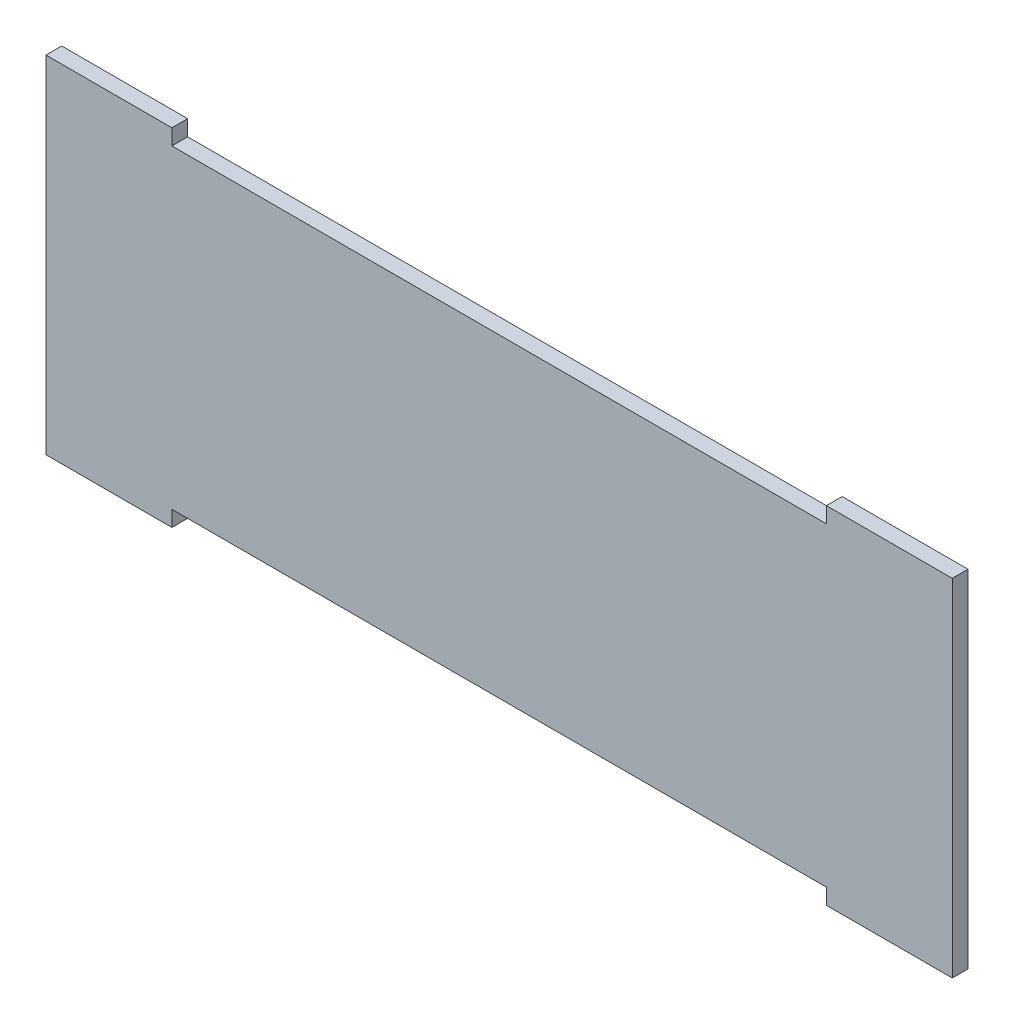
ISO-10303-21;
HEADER;
FILE_DESCRIPTION(('STEP AP214'),'2;1');
FILE_NAME('part.step','',(''),(''),'','','');
FILE_SCHEMA(('AUTOMOTIVE_DESIGN { 1 0 10303 214 1 1 1 1 }'));
ENDSEC;
DATA;
#1=APPLICATION_CONTEXT('core data for automotive mechanical design processes');
#2=APPLICATION_PROTOCOL_DEFINITION('international standard','automotive_design',2000,#1);
#3=PRODUCT_CONTEXT('',#1,'mechanical');
#4=PRODUCT('Part','Part','',(#3));
#5=PRODUCT_RELATED_PRODUCT_CATEGORY('part','',(#4));
#6=PRODUCT_DEFINITION_FORMATION('','',#4);
#7=PRODUCT_DEFINITION_CONTEXT('part definition',#1,'design');
#8=PRODUCT_DEFINITION('design','',#6,#7);
#9=PRODUCT_DEFINITION_SHAPE('','',#8);
#10=(LENGTH_UNIT() NAMED_UNIT(*) SI_UNIT(.MILLI.,.METRE.));
#11=(NAMED_UNIT(*) PLANE_ANGLE_UNIT() SI_UNIT($,.RADIAN.));
#12=(NAMED_UNIT(*) SI_UNIT($,.STERADIAN.) SOLID_ANGLE_UNIT());
#13=UNCERTAINTY_MEASURE_WITH_UNIT(LENGTH_MEASURE(1.E-05),#10,'distance_accuracy_value','');
#14=(GEOMETRIC_REPRESENTATION_CONTEXT(3) GLOBAL_UNCERTAINTY_ASSIGNED_CONTEXT((#13)) GLOBAL_UNIT_ASSIGNED_CONTEXT((#10,
#11,#12)) REPRESENTATION_CONTEXT('',''));
#15=CARTESIAN_POINT('',(0.,0.,0.));
#16=DIRECTION('',(0.,0.,1.));
#17=DIRECTION('',(1.,0.,0.));
#18=AXIS2_PLACEMENT_3D('',#15,#16,#17);
#19=CARTESIAN_POINT('',(-75.4550720880552,48.8403860002817,3.175));
#20=DIRECTION('',(1.,0.,0.));
#21=DIRECTION('',(0.,0.,-1.));
#22=AXIS2_PLACEMENT_3D('',#19,#20,#21);
#23=PLANE('',#22);
#24=DIRECTION('',(0.,-1.,0.));
#25=VECTOR('',#24,1.);
#26=CARTESIAN_POINT('',(-75.4550720880552,48.8403860002817,0.));
#27=LINE('',#26,#25);
#28=CARTESIAN_POINT('',(-75.4550720880552,48.8403860002817,0.));
#29=VERTEX_POINT('',#28);
#30=CARTESIAN_POINT('',(-75.4550720880552,-21.0096139997183,0.));
#31=VERTEX_POINT('',#30);
#32=EDGE_CURVE('E153',#29,#31,#27,.T.);
#33=ORIENTED_EDGE('',*,*,#32,.T.);
#34=DIRECTION('',(0.,0.,-1.));
#35=VECTOR('',#34,1.);
#36=CARTESIAN_POINT('',(-75.4550720880552,-21.0096139997183,3.175));
#37=LINE('',#36,#35);
#38=CARTESIAN_POINT('',(-75.4550720880552,-21.0096139997183,3.175));
#39=VERTEX_POINT('',#38);
#40=EDGE_CURVE('E11',#39,#31,#37,.T.);
#41=ORIENTED_EDGE('',*,*,#40,.F.);
#42=DIRECTION('',(0.,-1.,0.));
#43=VECTOR('',#42,1.);
#44=CARTESIAN_POINT('',(-75.4550720880552,48.8403860002817,3.175));
#45=LINE('',#44,#43);
#46=CARTESIAN_POINT('',(-75.4550720880552,48.8403860002817,3.175));
#47=VERTEX_POINT('',#46);
#48=EDGE_CURVE('E175',#47,#39,#45,.T.);
#49=ORIENTED_EDGE('',*,*,#48,.F.);
#50=DIRECTION('',(0.,0.,-1.));
#51=VECTOR('',#50,1.);
#52=CARTESIAN_POINT('',(-75.4550720880552,48.8403860002817,3.175));
#53=LINE('',#52,#51);
#54=EDGE_CURVE('E149',#47,#29,#53,.T.);
#55=ORIENTED_EDGE('',*,*,#54,.T.);
#56=EDGE_LOOP('',(#33,#41,#49,#55));
#57=FACE_BOUND('',#56,.T.);
#58=ADVANCED_FACE('F33',(#57),#23,.F.);
#59=CARTESIAN_POINT('',(-75.4550720880552,-21.0096139997183,3.175));
#60=DIRECTION('',(0.,1.,0.));
#61=DIRECTION('',(0.,0.,1.));
#62=AXIS2_PLACEMENT_3D('',#59,#60,#61);
#63=PLANE('',#62);
#64=DIRECTION('',(1.,0.,0.));
#65=VECTOR('',#64,1.);
#66=CARTESIAN_POINT('',(-75.4550720880552,-21.0096139997183,0.));
#67=LINE('',#66,#65);
#68=CARTESIAN_POINT('',(-50.0550720880552,-21.0096139997183,0.));
#69=VERTEX_POINT('',#68);
#70=EDGE_CURVE('E156',#31,#69,#67,.T.);
#71=ORIENTED_EDGE('',*,*,#70,.T.);
#72=DIRECTION('',(0.,0.,-1.));
#73=VECTOR('',#72,1.);
#74=CARTESIAN_POINT('',(-50.0550720880552,-21.0096139997183,3.175));
#75=LINE('',#74,#73);
#76=CARTESIAN_POINT('',(-50.0550720880552,-21.0096139997183,3.175));
#77=VERTEX_POINT('',#76);
#78=EDGE_CURVE('E41',#77,#69,#75,.T.);
#79=ORIENTED_EDGE('',*,*,#78,.F.);
#80=DIRECTION('',(1.,0.,0.));
#81=VECTOR('',#80,1.);
#82=CARTESIAN_POINT('',(-75.4550720880552,-21.0096139997183,3.175));
#83=LINE('',#82,#81);
#84=EDGE_CURVE('E104',#39,#77,#83,.T.);
#85=ORIENTED_EDGE('',*,*,#84,.F.);
#86=ORIENTED_EDGE('',*,*,#40,.T.);
#87=EDGE_LOOP('',(#71,#79,#85,#86));
#88=FACE_BOUND('',#87,.T.);
#89=ADVANCED_FACE('F253',(#88),#63,.F.);
#90=CARTESIAN_POINT('',(-50.0550720880552,-21.0096139997183,3.175));
#91=DIRECTION('',(-1.,0.,0.));
#92=DIRECTION('',(0.,-1.,0.));
#93=AXIS2_PLACEMENT_3D('',#90,#91,#92);
#94=PLANE('',#93);
#95=DIRECTION('',(0.,1.,0.));
#96=VECTOR('',#95,1.);
#97=CARTESIAN_POINT('',(-50.0550720880552,-21.0096139997183,0.));
#98=LINE('',#97,#96);
#99=CARTESIAN_POINT('',(-50.0550720880552,-17.8346139997183,0.));
#100=VERTEX_POINT('',#99);
#101=EDGE_CURVE('E158',#69,#100,#98,.T.);
#102=ORIENTED_EDGE('',*,*,#101,.T.);
#103=DIRECTION('',(0.,0.,-1.));
#104=VECTOR('',#103,1.);
#105=CARTESIAN_POINT('',(-50.0550720880552,-17.8346139997183,3.175));
#106=LINE('',#105,#104);
#107=CARTESIAN_POINT('',(-50.0550720880552,-17.8346139997183,3.175));
#108=VERTEX_POINT('',#107);
#109=EDGE_CURVE('E194',#108,#100,#106,.T.);
#110=ORIENTED_EDGE('',*,*,#109,.F.);
#111=DIRECTION('',(0.,1.,0.));
#112=VECTOR('',#111,1.);
#113=CARTESIAN_POINT('',(-50.0550720880552,-21.0096139997183,3.175));
#114=LINE('',#113,#112);
#115=EDGE_CURVE('E202',#77,#108,#114,.T.);
#116=ORIENTED_EDGE('',*,*,#115,.F.);
#117=ORIENTED_EDGE('',*,*,#78,.T.);
#118=EDGE_LOOP('',(#102,#110,#116,#117));
#119=FACE_BOUND('',#118,.T.);
#120=ADVANCED_FACE('F200',(#119),#94,.F.);
#121=CARTESIAN_POINT('',(-50.0550720880552,-17.8346139997183,3.175));
#122=DIRECTION('',(0.,1.,0.));
#123=DIRECTION('',(0.,0.,1.));
#124=AXIS2_PLACEMENT_3D('',#121,#122,#123);
#125=PLANE('',#124);
#126=DIRECTION('',(1.,0.,0.));
#127=VECTOR('',#126,1.);
#128=CARTESIAN_POINT('',(-50.0550720880552,-17.8346139997183,0.));
#129=LINE('',#128,#127);
#130=CARTESIAN_POINT('',(82.0249279119449,-17.8346139997183,0.));
#131=VERTEX_POINT('',#130);
#132=EDGE_CURVE('E160',#100,#131,#129,.T.);
#133=ORIENTED_EDGE('',*,*,#132,.T.);
#134=DIRECTION('',(0.,0.,-1.));
#135=VECTOR('',#134,1.);
#136=CARTESIAN_POINT('',(82.0249279119449,-17.8346139997183,3.175));
#137=LINE('',#136,#135);
#138=CARTESIAN_POINT('',(82.0249279119449,-17.8346139997183,3.175));
#139=VERTEX_POINT('',#138);
#140=EDGE_CURVE('E191',#139,#131,#137,.T.);
#141=ORIENTED_EDGE('',*,*,#140,.F.);
#142=DIRECTION('',(1.,0.,0.));
#143=VECTOR('',#142,1.);
#144=CARTESIAN_POINT('',(-50.0550720880552,-17.8346139997183,3.175));
#145=LINE('',#144,#143);
#146=EDGE_CURVE('E220',#108,#139,#145,.T.);
#147=ORIENTED_EDGE('',*,*,#146,.F.);
#148=ORIENTED_EDGE('',*,*,#109,.T.);
#149=EDGE_LOOP('',(#133,#141,#147,#148));
#150=FACE_BOUND('',#149,.T.);
#151=ADVANCED_FACE('F211',(#150),#125,.F.);
#152=CARTESIAN_POINT('',(82.0249279119448,-21.0096139997183,3.175));
#153=DIRECTION('',(1.,0.,0.));
#154=DIRECTION('',(0.,1.,0.));
#155=AXIS2_PLACEMENT_3D('',#152,#153,#154);
#156=PLANE('',#155);
#157=DIRECTION('',(0.,-1.,0.));
#158=VECTOR('',#157,1.);
#159=CARTESIAN_POINT('',(82.0249279119448,-21.0096139997183,0.));
#160=LINE('',#159,#158);
#161=CARTESIAN_POINT('',(82.0249279119448,-21.0096139997183,0.));
#162=VERTEX_POINT('',#161);
#163=EDGE_CURVE('E162',#131,#162,#160,.T.);
#164=ORIENTED_EDGE('',*,*,#163,.T.);
#165=DIRECTION('',(0.,0.,-1.));
#166=VECTOR('',#165,1.);
#167=CARTESIAN_POINT('',(82.0249279119448,-21.0096139997183,3.175));
#168=LINE('',#167,#166);
#169=CARTESIAN_POINT('',(82.0249279119448,-21.0096139997183,3.175));
#170=VERTEX_POINT('',#169);
#171=EDGE_CURVE('E188',#170,#162,#168,.T.);
#172=ORIENTED_EDGE('',*,*,#171,.F.);
#173=DIRECTION('',(0.,-1.,0.));
#174=VECTOR('',#173,1.);
#175=CARTESIAN_POINT('',(82.0249279119448,-21.0096139997183,3.175));
#176=LINE('',#175,#174);
#177=EDGE_CURVE('E217',#139,#170,#176,.T.);
#178=ORIENTED_EDGE('',*,*,#177,.F.);
#179=ORIENTED_EDGE('',*,*,#140,.T.);
#180=EDGE_LOOP('',(#164,#172,#178,#179));
#181=FACE_BOUND('',#180,.T.);
#182=ADVANCED_FACE('F215',(#181),#156,.F.);
#183=CARTESIAN_POINT('',(82.0249279119448,-21.0096139997183,3.175));
#184=DIRECTION('',(0.,1.,0.));
#185=DIRECTION('',(0.,0.,1.));
#186=AXIS2_PLACEMENT_3D('',#183,#184,#185);
#187=PLANE('',#186);
#188=DIRECTION('',(1.,0.,0.));
#189=VECTOR('',#188,1.);
#190=CARTESIAN_POINT('',(82.0249279119448,-21.0096139997183,0.));
#191=LINE('',#190,#189);
#192=CARTESIAN_POINT('',(107.424927911945,-21.0096139997183,0.));
#193=VERTEX_POINT('',#192);
#194=EDGE_CURVE('E164',#162,#193,#191,.T.);
#195=ORIENTED_EDGE('',*,*,#194,.T.);
#196=DIRECTION('',(0.,0.,-1.));
#197=VECTOR('',#196,1.);
#198=CARTESIAN_POINT('',(107.424927911945,-21.0096139997183,3.175));
#199=LINE('',#198,#197);
#200=CARTESIAN_POINT('',(107.424927911945,-21.0096139997183,3.175));
#201=VERTEX_POINT('',#200);
#202=EDGE_CURVE('E185',#201,#193,#199,.T.);
#203=ORIENTED_EDGE('',*,*,#202,.F.);
#204=DIRECTION('',(1.,0.,0.));
#205=VECTOR('',#204,1.);
#206=CARTESIAN_POINT('',(82.0249279119448,-21.0096139997183,3.175));
#207=LINE('',#206,#205);
#208=EDGE_CURVE('E219',#170,#201,#207,.T.);
#209=ORIENTED_EDGE('',*,*,#208,.F.);
#210=ORIENTED_EDGE('',*,*,#171,.T.);
#211=EDGE_LOOP('',(#195,#203,#209,#210));
#212=FACE_BOUND('',#211,.T.);
#213=ADVANCED_FACE('F266',(#212),#187,.F.);
#214=CARTESIAN_POINT('',(107.424927911945,48.8403860002817,3.175));
#215=DIRECTION('',(-1.,0.,0.));
#216=DIRECTION('',(0.,0.,1.));
#217=AXIS2_PLACEMENT_3D('',#214,#215,#216);
#218=PLANE('',#217);
#219=DIRECTION('',(0.,1.,0.));
#220=VECTOR('',#219,1.);
#221=CARTESIAN_POINT('',(107.424927911945,48.8403860002817,0.));
#222=LINE('',#221,#220);
#223=CARTESIAN_POINT('',(107.424927911945,48.8403860002817,0.));
#224=VERTEX_POINT('',#223);
#225=EDGE_CURVE('E166',#193,#224,#222,.T.);
#226=ORIENTED_EDGE('',*,*,#225,.T.);
#227=DIRECTION('',(0.,0.,-1.));
#228=VECTOR('',#227,1.);
#229=CARTESIAN_POINT('',(107.424927911945,48.8403860002817,3.175));
#230=LINE('',#229,#228);
#231=CARTESIAN_POINT('',(107.424927911945,48.8403860002817,3.175));
#232=VERTEX_POINT('',#231);
#233=EDGE_CURVE('E182',#232,#224,#230,.T.);
#234=ORIENTED_EDGE('',*,*,#233,.F.);
#235=DIRECTION('',(0.,1.,0.));
#236=VECTOR('',#235,1.);
#237=CARTESIAN_POINT('',(107.424927911945,48.8403860002817,3.175));
#238=LINE('',#237,#236);
#239=EDGE_CURVE('E222',#201,#232,#238,.T.);
#240=ORIENTED_EDGE('',*,*,#239,.F.);
#241=ORIENTED_EDGE('',*,*,#202,.T.);
#242=EDGE_LOOP('',(#226,#234,#240,#241));
#243=FACE_BOUND('',#242,.T.);
#244=ADVANCED_FACE('F269',(#243),#218,.F.);
#245=CARTESIAN_POINT('',(82.0249279119448,48.8403860002817,3.175));
#246=DIRECTION('',(0.,-1.,0.));
#247=DIRECTION('',(0.,0.,-1.));
#248=AXIS2_PLACEMENT_3D('',#245,#246,#247);
#249=PLANE('',#248);
#250=DIRECTION('',(-1.,0.,0.));
#251=VECTOR('',#250,1.);
#252=CARTESIAN_POINT('',(82.0249279119448,48.8403860002817,0.));
#253=LINE('',#252,#251);
#254=CARTESIAN_POINT('',(82.0249279119448,48.8403860002817,0.));
#255=VERTEX_POINT('',#254);
#256=EDGE_CURVE('E168',#224,#255,#253,.T.);
#257=ORIENTED_EDGE('',*,*,#256,.T.);
#258=DIRECTION('',(0.,0.,-1.));
#259=VECTOR('',#258,1.);
#260=CARTESIAN_POINT('',(82.0249279119448,48.8403860002817,3.175));
#261=LINE('',#260,#259);
#262=CARTESIAN_POINT('',(82.0249279119448,48.8403860002817,3.175));
#263=VERTEX_POINT('',#262);
#264=EDGE_CURVE('E179',#263,#255,#261,.T.);
#265=ORIENTED_EDGE('',*,*,#264,.F.);
#266=DIRECTION('',(-1.,0.,0.));
#267=VECTOR('',#266,1.);
#268=CARTESIAN_POINT('',(82.0249279119448,48.8403860002817,3.175));
#269=LINE('',#268,#267);
#270=EDGE_CURVE('E228',#232,#263,#269,.T.);
#271=ORIENTED_EDGE('',*,*,#270,.F.);
#272=ORIENTED_EDGE('',*,*,#233,.T.);
#273=EDGE_LOOP('',(#257,#265,#271,#272));
#274=FACE_BOUND('',#273,.T.);
#275=ADVANCED_FACE('F234',(#274),#249,.F.);
#276=CARTESIAN_POINT('',(82.0249279119448,48.8403860002817,3.175));
#277=DIRECTION('',(1.,0.,0.));
#278=DIRECTION('',(0.,0.,-1.));
#279=AXIS2_PLACEMENT_3D('',#276,#277,#278);
#280=PLANE('',#279);
#281=DIRECTION('',(0.,-1.,0.));
#282=VECTOR('',#281,1.);
#283=CARTESIAN_POINT('',(82.0249279119448,48.8403860002817,0.));
#284=LINE('',#283,#282);
#285=CARTESIAN_POINT('',(82.0249279119448,45.6653860002817,0.));
#286=VERTEX_POINT('',#285);
#287=EDGE_CURVE('E170',#255,#286,#284,.T.);
#288=ORIENTED_EDGE('',*,*,#287,.T.);
#289=DIRECTION('',(0.,0.,-1.));
#290=VECTOR('',#289,1.);
#291=CARTESIAN_POINT('',(82.0249279119448,45.6653860002817,3.175));
#292=LINE('',#291,#290);
#293=CARTESIAN_POINT('',(82.0249279119448,45.6653860002817,3.175));
#294=VERTEX_POINT('',#293);
#295=EDGE_CURVE('E144',#294,#286,#292,.T.);
#296=ORIENTED_EDGE('',*,*,#295,.F.);
#297=DIRECTION('',(0.,-1.,0.));
#298=VECTOR('',#297,1.);
#299=CARTESIAN_POINT('',(82.0249279119448,48.8403860002817,3.175));
#300=LINE('',#299,#298);
#301=EDGE_CURVE('E135',#263,#294,#300,.T.);
#302=ORIENTED_EDGE('',*,*,#301,.F.);
#303=ORIENTED_EDGE('',*,*,#264,.T.);
#304=EDGE_LOOP('',(#288,#296,#302,#303));
#305=FACE_BOUND('',#304,.T.);
#306=ADVANCED_FACE('F238',(#305),#280,.F.);
#307=CARTESIAN_POINT('',(-50.0550720880552,45.6653860002817,3.175));
#308=DIRECTION('',(0.,-1.,0.));
#309=DIRECTION('',(0.,0.,-1.));
#310=AXIS2_PLACEMENT_3D('',#307,#308,#309);
#311=PLANE('',#310);
#312=DIRECTION('',(-1.,0.,0.));
#313=VECTOR('',#312,1.);
#314=CARTESIAN_POINT('',(-50.0550720880552,45.6653860002817,0.));
#315=LINE('',#314,#313);
#316=CARTESIAN_POINT('',(-50.0550720880552,45.6653860002817,0.));
#317=VERTEX_POINT('',#316);
#318=EDGE_CURVE('E143',#286,#317,#315,.T.);
#319=ORIENTED_EDGE('',*,*,#318,.T.);
#320=DIRECTION('',(0.,0.,-1.));
#321=VECTOR('',#320,1.);
#322=CARTESIAN_POINT('',(-50.0550720880552,45.6653860002817,3.175));
#323=LINE('',#322,#321);
#324=CARTESIAN_POINT('',(-50.0550720880552,45.6653860002817,3.175));
#325=VERTEX_POINT('',#324);
#326=EDGE_CURVE('E140',#325,#317,#323,.T.);
#327=ORIENTED_EDGE('',*,*,#326,.F.);
#328=DIRECTION('',(-1.,0.,0.));
#329=VECTOR('',#328,1.);
#330=CARTESIAN_POINT('',(-50.0550720880552,45.6653860002817,3.175));
#331=LINE('',#330,#329);
#332=EDGE_CURVE('E129',#294,#325,#331,.T.);
#333=ORIENTED_EDGE('',*,*,#332,.F.);
#334=ORIENTED_EDGE('',*,*,#295,.T.);
#335=EDGE_LOOP('',(#319,#327,#333,#334));
#336=FACE_BOUND('',#335,.T.);
#337=ADVANCED_FACE('F141',(#336),#311,.F.);
#338=CARTESIAN_POINT('',(-50.0550720880552,48.8403860002817,3.175));
#339=DIRECTION('',(-1.,0.,0.));
#340=DIRECTION('',(0.,0.,1.));
#341=AXIS2_PLACEMENT_3D('',#338,#339,#340);
#342=PLANE('',#341);
#343=DIRECTION('',(0.,1.,0.));
#344=VECTOR('',#343,1.);
#345=CARTESIAN_POINT('',(-50.0550720880552,48.8403860002817,0.));
#346=LINE('',#345,#344);
#347=CARTESIAN_POINT('',(-50.0550720880552,48.8403860002817,0.));
#348=VERTEX_POINT('',#347);
#349=EDGE_CURVE('E90',#317,#348,#346,.T.);
#350=ORIENTED_EDGE('',*,*,#349,.T.);
#351=DIRECTION('',(0.,0.,-1.));
#352=VECTOR('',#351,1.);
#353=CARTESIAN_POINT('',(-50.0550720880552,48.8403860002817,3.175));
#354=LINE('',#353,#352);
#355=CARTESIAN_POINT('',(-50.0550720880552,48.8403860002817,3.175));
#356=VERTEX_POINT('',#355);
#357=EDGE_CURVE('E145',#356,#348,#354,.T.);
#358=ORIENTED_EDGE('',*,*,#357,.F.);
#359=DIRECTION('',(0.,1.,0.));
#360=VECTOR('',#359,1.);
#361=CARTESIAN_POINT('',(-50.0550720880552,48.8403860002817,3.175));
#362=LINE('',#361,#360);
#363=EDGE_CURVE('E133',#325,#356,#362,.T.);
#364=ORIENTED_EDGE('',*,*,#363,.F.);
#365=ORIENTED_EDGE('',*,*,#326,.T.);
#366=EDGE_LOOP('',(#350,#358,#364,#365));
#367=FACE_BOUND('',#366,.T.);
#368=ADVANCED_FACE('F147',(#367),#342,.F.);
#369=CARTESIAN_POINT('',(-75.4550720880552,48.8403860002817,3.175));
#370=DIRECTION('',(0.,-1.,0.));
#371=DIRECTION('',(0.,0.,-1.));
#372=AXIS2_PLACEMENT_3D('',#369,#370,#371);
#373=PLANE('',#372);
#374=DIRECTION('',(-1.,0.,0.));
#375=VECTOR('',#374,1.);
#376=CARTESIAN_POINT('',(-75.4550720880552,48.8403860002817,0.));
#377=LINE('',#376,#375);
#378=EDGE_CURVE('E96',#348,#29,#377,.T.);
#379=ORIENTED_EDGE('',*,*,#378,.T.);
#380=ORIENTED_EDGE('',*,*,#54,.F.);
#381=DIRECTION('',(-1.,0.,0.));
#382=VECTOR('',#381,1.);
#383=CARTESIAN_POINT('',(-75.4550720880552,48.8403860002817,3.175));
#384=LINE('',#383,#382);
#385=EDGE_CURVE('E49',#356,#47,#384,.T.);
#386=ORIENTED_EDGE('',*,*,#385,.F.);
#387=ORIENTED_EDGE('',*,*,#357,.T.);
#388=EDGE_LOOP('',(#379,#380,#386,#387));
#389=FACE_BOUND('',#388,.T.);
#390=ADVANCED_FACE('F242',(#389),#373,.F.);
#391=CARTESIAN_POINT('',(0.,0.,3.175));
#392=DIRECTION('',(0.,0.,1.));
#393=DIRECTION('',(1.,0.,0.));
#394=AXIS2_PLACEMENT_3D('',#391,#392,#393);
#395=PLANE('',#394);
#396=ORIENTED_EDGE('',*,*,#48,.T.);
#397=ORIENTED_EDGE('',*,*,#84,.T.);
#398=ORIENTED_EDGE('',*,*,#115,.T.);
#399=ORIENTED_EDGE('',*,*,#146,.T.);
#400=ORIENTED_EDGE('',*,*,#177,.T.);
#401=ORIENTED_EDGE('',*,*,#208,.T.);
#402=ORIENTED_EDGE('',*,*,#239,.T.);
#403=ORIENTED_EDGE('',*,*,#270,.T.);
#404=ORIENTED_EDGE('',*,*,#301,.T.);
#405=ORIENTED_EDGE('',*,*,#332,.T.);
#406=ORIENTED_EDGE('',*,*,#363,.T.);
#407=ORIENTED_EDGE('',*,*,#385,.T.);
#408=EDGE_LOOP('',(#396,#397,#398,#399,#400,#401,#402,#403,#404,#405,#406,#407));
#409=FACE_BOUND('',#408,.T.);
#410=ADVANCED_FACE('F131',(#409),#395,.T.);
#411=CARTESIAN_POINT('',(0.,0.,0.));
#412=DIRECTION('',(0.,0.,1.));
#413=DIRECTION('',(1.,0.,0.));
#414=AXIS2_PLACEMENT_3D('',#411,#412,#413);
#415=PLANE('',#414);
#416=ORIENTED_EDGE('',*,*,#32,.F.);
#417=ORIENTED_EDGE('',*,*,#378,.F.);
#418=ORIENTED_EDGE('',*,*,#349,.F.);
#419=ORIENTED_EDGE('',*,*,#318,.F.);
#420=ORIENTED_EDGE('',*,*,#287,.F.);
#421=ORIENTED_EDGE('',*,*,#256,.F.);
#422=ORIENTED_EDGE('',*,*,#225,.F.);
#423=ORIENTED_EDGE('',*,*,#194,.F.);
#424=ORIENTED_EDGE('',*,*,#163,.F.);
#425=ORIENTED_EDGE('',*,*,#132,.F.);
#426=ORIENTED_EDGE('',*,*,#101,.F.);
#427=ORIENTED_EDGE('',*,*,#70,.F.);
#428=EDGE_LOOP('',(#416,#417,#418,#419,#420,#421,#422,#423,#424,#425,#426,#427));
#429=FACE_BOUND('',#428,.T.);
#430=ADVANCED_FACE('F206',(#429),#415,.F.);
#431=CLOSED_SHELL('',(#58,#89,#120,#151,#182,#213,#244,#275,#306,#337,#368,#390,#410,#430));
#432=MANIFOLD_SOLID_BREP('B2',#431);
#433=ADVANCED_BREP_SHAPE_REPRESENTATION('',(#18,#432),#14);
#434=SHAPE_DEFINITION_REPRESENTATION(#9,#433);
ENDSEC;
END-ISO-10303-21;
